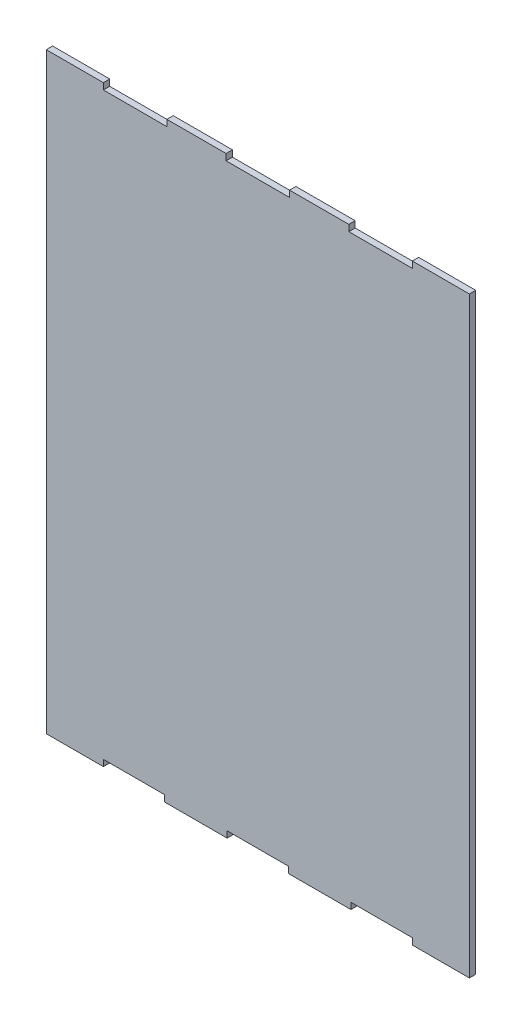
ISO-10303-21;
HEADER;
FILE_DESCRIPTION(('STEP AP214'),'2;1');
FILE_NAME('part.step','',(''),(''),'','','');
FILE_SCHEMA(('AUTOMOTIVE_DESIGN { 1 0 10303 214 1 1 1 1 }'));
ENDSEC;
DATA;
#1=APPLICATION_CONTEXT('core data for automotive mechanical design processes');
#2=APPLICATION_PROTOCOL_DEFINITION('international standard','automotive_design',2000,#1);
#3=PRODUCT_CONTEXT('',#1,'mechanical');
#4=PRODUCT('Part','Part','',(#3));
#5=PRODUCT_RELATED_PRODUCT_CATEGORY('part','',(#4));
#6=PRODUCT_DEFINITION_FORMATION('','',#4);
#7=PRODUCT_DEFINITION_CONTEXT('part definition',#1,'design');
#8=PRODUCT_DEFINITION('design','',#6,#7);
#9=PRODUCT_DEFINITION_SHAPE('','',#8);
#10=(LENGTH_UNIT() NAMED_UNIT(*) SI_UNIT(.MILLI.,.METRE.));
#11=(NAMED_UNIT(*) PLANE_ANGLE_UNIT() SI_UNIT($,.RADIAN.));
#12=(NAMED_UNIT(*) SI_UNIT($,.STERADIAN.) SOLID_ANGLE_UNIT());
#13=UNCERTAINTY_MEASURE_WITH_UNIT(LENGTH_MEASURE(1.E-05),#10,'distance_accuracy_value','');
#14=(GEOMETRIC_REPRESENTATION_CONTEXT(3) GLOBAL_UNCERTAINTY_ASSIGNED_CONTEXT((#13)) GLOBAL_UNIT_ASSIGNED_CONTEXT((#10,
#11,#12)) REPRESENTATION_CONTEXT('',''));
#15=CARTESIAN_POINT('',(0.,0.,0.));
#16=DIRECTION('',(0.,0.,1.));
#17=DIRECTION('',(1.,0.,0.));
#18=AXIS2_PLACEMENT_3D('',#15,#16,#17);
#19=CARTESIAN_POINT('',(0.,140.,3.));
#20=DIRECTION('',(0.,1.,0.));
#21=DIRECTION('',(0.,0.,1.));
#22=AXIS2_PLACEMENT_3D('',#19,#20,#21);
#23=PLANE('',#22);
#24=DIRECTION('',(1.,0.,0.));
#25=VECTOR('',#24,1.);
#26=CARTESIAN_POINT('',(0.,140.,0.));
#27=LINE('',#26,#25);
#28=CARTESIAN_POINT('',(76.,140.,0.));
#29=VERTEX_POINT('',#28);
#30=CARTESIAN_POINT('',(103.,140.,0.));
#31=VERTEX_POINT('',#30);
#32=EDGE_CURVE('E262',#29,#31,#27,.T.);
#33=ORIENTED_EDGE('',*,*,#32,.F.);
#34=DIRECTION('',(0.,0.,-1.));
#35=VECTOR('',#34,1.);
#36=CARTESIAN_POINT('',(76.,140.,3.));
#37=LINE('',#36,#35);
#38=CARTESIAN_POINT('',(76.,140.,3.));
#39=VERTEX_POINT('',#38);
#40=EDGE_CURVE('E11',#39,#29,#37,.T.);
#41=ORIENTED_EDGE('',*,*,#40,.F.);
#42=DIRECTION('',(1.,0.,0.));
#43=VECTOR('',#42,1.);
#44=CARTESIAN_POINT('',(0.,140.,3.));
#45=LINE('',#44,#43);
#46=CARTESIAN_POINT('',(103.,140.,3.));
#47=VERTEX_POINT('',#46);
#48=EDGE_CURVE('E363',#39,#47,#45,.T.);
#49=ORIENTED_EDGE('',*,*,#48,.T.);
#50=DIRECTION('',(0.,0.,-1.));
#51=VECTOR('',#50,1.);
#52=CARTESIAN_POINT('',(103.,140.,3.));
#53=LINE('',#52,#51);
#54=EDGE_CURVE('E58',#47,#31,#53,.T.);
#55=ORIENTED_EDGE('',*,*,#54,.T.);
#56=EDGE_LOOP('',(#33,#41,#49,#55));
#57=FACE_BOUND('',#56,.T.);
#58=ADVANCED_FACE('F41',(#57),#23,.T.);
#59=CARTESIAN_POINT('',(76.,0.,3.));
#60=DIRECTION('',(1.,0.,0.));
#61=DIRECTION('',(0.,0.,-1.));
#62=AXIS2_PLACEMENT_3D('',#59,#60,#61);
#63=PLANE('',#62);
#64=DIRECTION('',(0.,-1.,0.));
#65=VECTOR('',#64,1.);
#66=CARTESIAN_POINT('',(76.,0.,0.));
#67=LINE('',#66,#65);
#68=CARTESIAN_POINT('',(76.,137.,0.));
#69=VERTEX_POINT('',#68);
#70=EDGE_CURVE('E265',#29,#69,#67,.T.);
#71=ORIENTED_EDGE('',*,*,#70,.T.);
#72=DIRECTION('',(0.,0.,-1.));
#73=VECTOR('',#72,1.);
#74=CARTESIAN_POINT('',(76.,137.,3.));
#75=LINE('',#74,#73);
#76=CARTESIAN_POINT('',(76.,137.,3.));
#77=VERTEX_POINT('',#76);
#78=EDGE_CURVE('E50',#77,#69,#75,.T.);
#79=ORIENTED_EDGE('',*,*,#78,.F.);
#80=DIRECTION('',(0.,-1.,0.));
#81=VECTOR('',#80,1.);
#82=CARTESIAN_POINT('',(76.,0.,3.));
#83=LINE('',#82,#81);
#84=EDGE_CURVE('E465',#39,#77,#83,.T.);
#85=ORIENTED_EDGE('',*,*,#84,.F.);
#86=ORIENTED_EDGE('',*,*,#40,.T.);
#87=EDGE_LOOP('',(#71,#79,#85,#86));
#88=FACE_BOUND('',#87,.T.);
#89=ADVANCED_FACE('F452',(#88),#63,.F.);
#90=CARTESIAN_POINT('',(0.,137.,3.));
#91=DIRECTION('',(0.,1.,0.));
#92=DIRECTION('',(0.,0.,1.));
#93=AXIS2_PLACEMENT_3D('',#90,#91,#92);
#94=PLANE('',#93);
#95=DIRECTION('',(1.,0.,0.));
#96=VECTOR('',#95,1.);
#97=CARTESIAN_POINT('',(0.,137.,0.));
#98=LINE('',#97,#96);
#99=CARTESIAN_POINT('',(46.,137.,0.));
#100=VERTEX_POINT('',#99);
#101=EDGE_CURVE('E269',#100,#69,#98,.T.);
#102=ORIENTED_EDGE('',*,*,#101,.F.);
#103=DIRECTION('',(0.,0.,-1.));
#104=VECTOR('',#103,1.);
#105=CARTESIAN_POINT('',(46.,137.,3.));
#106=LINE('',#105,#104);
#107=CARTESIAN_POINT('',(46.,137.,3.));
#108=VERTEX_POINT('',#107);
#109=EDGE_CURVE('E440',#108,#100,#106,.T.);
#110=ORIENTED_EDGE('',*,*,#109,.F.);
#111=DIRECTION('',(1.,0.,0.));
#112=VECTOR('',#111,1.);
#113=CARTESIAN_POINT('',(0.,137.,3.));
#114=LINE('',#113,#112);
#115=EDGE_CURVE('E449',#108,#77,#114,.T.);
#116=ORIENTED_EDGE('',*,*,#115,.T.);
#117=ORIENTED_EDGE('',*,*,#78,.T.);
#118=EDGE_LOOP('',(#102,#110,#116,#117));
#119=FACE_BOUND('',#118,.T.);
#120=ADVANCED_FACE('F447',(#119),#94,.T.);
#121=CARTESIAN_POINT('',(46.,0.,3.));
#122=DIRECTION('',(1.,0.,0.));
#123=DIRECTION('',(0.,0.,-1.));
#124=AXIS2_PLACEMENT_3D('',#121,#122,#123);
#125=PLANE('',#124);
#126=DIRECTION('',(0.,-1.,0.));
#127=VECTOR('',#126,1.);
#128=CARTESIAN_POINT('',(46.,0.,0.));
#129=LINE('',#128,#127);
#130=CARTESIAN_POINT('',(46.,140.,0.));
#131=VERTEX_POINT('',#130);
#132=EDGE_CURVE('E273',#131,#100,#129,.T.);
#133=ORIENTED_EDGE('',*,*,#132,.F.);
#134=DIRECTION('',(0.,0.,-1.));
#135=VECTOR('',#134,1.);
#136=CARTESIAN_POINT('',(46.,140.,3.));
#137=LINE('',#136,#135);
#138=CARTESIAN_POINT('',(46.,140.,3.));
#139=VERTEX_POINT('',#138);
#140=EDGE_CURVE('E437',#139,#131,#137,.T.);
#141=ORIENTED_EDGE('',*,*,#140,.F.);
#142=DIRECTION('',(0.,-1.,0.));
#143=VECTOR('',#142,1.);
#144=CARTESIAN_POINT('',(46.,0.,3.));
#145=LINE('',#144,#143);
#146=EDGE_CURVE('E462',#139,#108,#145,.T.);
#147=ORIENTED_EDGE('',*,*,#146,.T.);
#148=ORIENTED_EDGE('',*,*,#109,.T.);
#149=EDGE_LOOP('',(#133,#141,#147,#148));
#150=FACE_BOUND('',#149,.T.);
#151=ADVANCED_FACE('F459',(#150),#125,.T.);
#152=CARTESIAN_POINT('',(0.,140.,3.));
#153=DIRECTION('',(0.,1.,0.));
#154=DIRECTION('',(0.,0.,1.));
#155=AXIS2_PLACEMENT_3D('',#152,#153,#154);
#156=PLANE('',#155);
#157=DIRECTION('',(1.,0.,0.));
#158=VECTOR('',#157,1.);
#159=CARTESIAN_POINT('',(0.,140.,0.));
#160=LINE('',#159,#158);
#161=CARTESIAN_POINT('',(18.,140.,0.));
#162=VERTEX_POINT('',#161);
#163=EDGE_CURVE('E277',#162,#131,#160,.T.);
#164=ORIENTED_EDGE('',*,*,#163,.F.);
#165=DIRECTION('',(0.,0.,-1.));
#166=VECTOR('',#165,1.);
#167=CARTESIAN_POINT('',(18.,140.,3.));
#168=LINE('',#167,#166);
#169=CARTESIAN_POINT('',(18.,140.,3.));
#170=VERTEX_POINT('',#169);
#171=EDGE_CURVE('E434',#170,#162,#168,.T.);
#172=ORIENTED_EDGE('',*,*,#171,.F.);
#173=DIRECTION('',(1.,0.,0.));
#174=VECTOR('',#173,1.);
#175=CARTESIAN_POINT('',(0.,140.,3.));
#176=LINE('',#175,#174);
#177=EDGE_CURVE('E470',#170,#139,#176,.T.);
#178=ORIENTED_EDGE('',*,*,#177,.T.);
#179=ORIENTED_EDGE('',*,*,#140,.T.);
#180=EDGE_LOOP('',(#164,#172,#178,#179));
#181=FACE_BOUND('',#180,.T.);
#182=ADVANCED_FACE('F571',(#181),#156,.T.);
#183=CARTESIAN_POINT('',(18.,0.,3.));
#184=DIRECTION('',(1.,0.,0.));
#185=DIRECTION('',(0.,0.,-1.));
#186=AXIS2_PLACEMENT_3D('',#183,#184,#185);
#187=PLANE('',#186);
#188=DIRECTION('',(0.,-1.,0.));
#189=VECTOR('',#188,1.);
#190=CARTESIAN_POINT('',(18.,0.,0.));
#191=LINE('',#190,#189);
#192=CARTESIAN_POINT('',(18.,137.,0.));
#193=VERTEX_POINT('',#192);
#194=EDGE_CURVE('E281',#162,#193,#191,.T.);
#195=ORIENTED_EDGE('',*,*,#194,.T.);
#196=DIRECTION('',(0.,0.,-1.));
#197=VECTOR('',#196,1.);
#198=CARTESIAN_POINT('',(18.,137.,3.));
#199=LINE('',#198,#197);
#200=CARTESIAN_POINT('',(18.,137.,3.));
#201=VERTEX_POINT('',#200);
#202=EDGE_CURVE('E431',#201,#193,#199,.T.);
#203=ORIENTED_EDGE('',*,*,#202,.F.);
#204=DIRECTION('',(0.,-1.,0.));
#205=VECTOR('',#204,1.);
#206=CARTESIAN_POINT('',(18.,0.,3.));
#207=LINE('',#206,#205);
#208=EDGE_CURVE('E477',#170,#201,#207,.T.);
#209=ORIENTED_EDGE('',*,*,#208,.F.);
#210=ORIENTED_EDGE('',*,*,#171,.T.);
#211=EDGE_LOOP('',(#195,#203,#209,#210));
#212=FACE_BOUND('',#211,.T.);
#213=ADVANCED_FACE('F574',(#212),#187,.F.);
#214=CARTESIAN_POINT('',(0.,137.,3.));
#215=DIRECTION('',(0.,1.,0.));
#216=DIRECTION('',(0.,0.,1.));
#217=AXIS2_PLACEMENT_3D('',#214,#215,#216);
#218=PLANE('',#217);
#219=DIRECTION('',(1.,0.,0.));
#220=VECTOR('',#219,1.);
#221=CARTESIAN_POINT('',(0.,137.,0.));
#222=LINE('',#221,#220);
#223=CARTESIAN_POINT('',(-12.,137.,0.));
#224=VERTEX_POINT('',#223);
#225=EDGE_CURVE('E285',#224,#193,#222,.T.);
#226=ORIENTED_EDGE('',*,*,#225,.F.);
#227=DIRECTION('',(0.,0.,-1.));
#228=VECTOR('',#227,1.);
#229=CARTESIAN_POINT('',(-12.,137.,3.));
#230=LINE('',#229,#228);
#231=CARTESIAN_POINT('',(-12.,137.,3.));
#232=VERTEX_POINT('',#231);
#233=EDGE_CURVE('E428',#232,#224,#230,.T.);
#234=ORIENTED_EDGE('',*,*,#233,.F.);
#235=DIRECTION('',(1.,0.,0.));
#236=VECTOR('',#235,1.);
#237=CARTESIAN_POINT('',(0.,137.,3.));
#238=LINE('',#237,#236);
#239=EDGE_CURVE('E480',#232,#201,#238,.T.);
#240=ORIENTED_EDGE('',*,*,#239,.T.);
#241=ORIENTED_EDGE('',*,*,#202,.T.);
#242=EDGE_LOOP('',(#226,#234,#240,#241));
#243=FACE_BOUND('',#242,.T.);
#244=ADVANCED_FACE('F578',(#243),#218,.T.);
#245=CARTESIAN_POINT('',(-12.,0.,3.));
#246=DIRECTION('',(1.,0.,0.));
#247=DIRECTION('',(0.,0.,-1.));
#248=AXIS2_PLACEMENT_3D('',#245,#246,#247);
#249=PLANE('',#248);
#250=DIRECTION('',(0.,-1.,0.));
#251=VECTOR('',#250,1.);
#252=CARTESIAN_POINT('',(-12.,0.,0.));
#253=LINE('',#252,#251);
#254=CARTESIAN_POINT('',(-12.,140.,0.));
#255=VERTEX_POINT('',#254);
#256=EDGE_CURVE('E289',#255,#224,#253,.T.);
#257=ORIENTED_EDGE('',*,*,#256,.F.);
#258=DIRECTION('',(0.,0.,-1.));
#259=VECTOR('',#258,1.);
#260=CARTESIAN_POINT('',(-12.,140.,3.));
#261=LINE('',#260,#259);
#262=CARTESIAN_POINT('',(-12.,140.,3.));
#263=VERTEX_POINT('',#262);
#264=EDGE_CURVE('E425',#263,#255,#261,.T.);
#265=ORIENTED_EDGE('',*,*,#264,.F.);
#266=DIRECTION('',(0.,-1.,0.));
#267=VECTOR('',#266,1.);
#268=CARTESIAN_POINT('',(-12.,0.,3.));
#269=LINE('',#268,#267);
#270=EDGE_CURVE('E484',#263,#232,#269,.T.);
#271=ORIENTED_EDGE('',*,*,#270,.T.);
#272=ORIENTED_EDGE('',*,*,#233,.T.);
#273=EDGE_LOOP('',(#257,#265,#271,#272));
#274=FACE_BOUND('',#273,.T.);
#275=ADVANCED_FACE('F582',(#274),#249,.T.);
#276=CARTESIAN_POINT('',(0.,140.,3.));
#277=DIRECTION('',(0.,1.,0.));
#278=DIRECTION('',(0.,0.,1.));
#279=AXIS2_PLACEMENT_3D('',#276,#277,#278);
#280=PLANE('',#279);
#281=DIRECTION('',(1.,0.,0.));
#282=VECTOR('',#281,1.);
#283=CARTESIAN_POINT('',(0.,140.,0.));
#284=LINE('',#283,#282);
#285=CARTESIAN_POINT('',(-40.,140.,0.));
#286=VERTEX_POINT('',#285);
#287=EDGE_CURVE('E293',#286,#255,#284,.T.);
#288=ORIENTED_EDGE('',*,*,#287,.F.);
#289=DIRECTION('',(0.,0.,-1.));
#290=VECTOR('',#289,1.);
#291=CARTESIAN_POINT('',(-40.,140.,3.));
#292=LINE('',#291,#290);
#293=CARTESIAN_POINT('',(-40.,140.,3.));
#294=VERTEX_POINT('',#293);
#295=EDGE_CURVE('E422',#294,#286,#292,.T.);
#296=ORIENTED_EDGE('',*,*,#295,.F.);
#297=DIRECTION('',(1.,0.,0.));
#298=VECTOR('',#297,1.);
#299=CARTESIAN_POINT('',(0.,140.,3.));
#300=LINE('',#299,#298);
#301=EDGE_CURVE('E488',#294,#263,#300,.T.);
#302=ORIENTED_EDGE('',*,*,#301,.T.);
#303=ORIENTED_EDGE('',*,*,#264,.T.);
#304=EDGE_LOOP('',(#288,#296,#302,#303));
#305=FACE_BOUND('',#304,.T.);
#306=ADVANCED_FACE('F586',(#305),#280,.T.);
#307=CARTESIAN_POINT('',(-39.9999999999997,0.,3.));
#308=DIRECTION('',(1.,0.,0.));
#309=DIRECTION('',(0.,1.,0.));
#310=AXIS2_PLACEMENT_3D('',#307,#308,#309);
#311=PLANE('',#310);
#312=DIRECTION('',(0.,-1.,0.));
#313=VECTOR('',#312,1.);
#314=CARTESIAN_POINT('',(-39.9999999999997,0.,0.));
#315=LINE('',#314,#313);
#316=CARTESIAN_POINT('',(-40.,137.,0.));
#317=VERTEX_POINT('',#316);
#318=EDGE_CURVE('E297',#286,#317,#315,.T.);
#319=ORIENTED_EDGE('',*,*,#318,.T.);
#320=DIRECTION('',(0.,0.,-1.));
#321=VECTOR('',#320,1.);
#322=CARTESIAN_POINT('',(-40.,137.,3.));
#323=LINE('',#322,#321);
#324=CARTESIAN_POINT('',(-40.,137.,3.));
#325=VERTEX_POINT('',#324);
#326=EDGE_CURVE('E419',#325,#317,#323,.T.);
#327=ORIENTED_EDGE('',*,*,#326,.F.);
#328=DIRECTION('',(0.,-1.,0.));
#329=VECTOR('',#328,1.);
#330=CARTESIAN_POINT('',(-39.9999999999997,0.,3.));
#331=LINE('',#330,#329);
#332=EDGE_CURVE('E492',#294,#325,#331,.T.);
#333=ORIENTED_EDGE('',*,*,#332,.F.);
#334=ORIENTED_EDGE('',*,*,#295,.T.);
#335=EDGE_LOOP('',(#319,#327,#333,#334));
#336=FACE_BOUND('',#335,.T.);
#337=ADVANCED_FACE('F590',(#336),#311,.F.);
#338=CARTESIAN_POINT('',(0.,137.,3.));
#339=DIRECTION('',(0.,1.,0.));
#340=DIRECTION('',(0.,0.,1.));
#341=AXIS2_PLACEMENT_3D('',#338,#339,#340);
#342=PLANE('',#341);
#343=DIRECTION('',(1.,0.,0.));
#344=VECTOR('',#343,1.);
#345=CARTESIAN_POINT('',(0.,137.,0.));
#346=LINE('',#345,#344);
#347=CARTESIAN_POINT('',(-70.,137.,0.));
#348=VERTEX_POINT('',#347);
#349=EDGE_CURVE('E301',#348,#317,#346,.T.);
#350=ORIENTED_EDGE('',*,*,#349,.F.);
#351=DIRECTION('',(0.,0.,-1.));
#352=VECTOR('',#351,1.);
#353=CARTESIAN_POINT('',(-70.,137.,3.));
#354=LINE('',#353,#352);
#355=CARTESIAN_POINT('',(-70.,137.,3.));
#356=VERTEX_POINT('',#355);
#357=EDGE_CURVE('E416',#356,#348,#354,.T.);
#358=ORIENTED_EDGE('',*,*,#357,.F.);
#359=DIRECTION('',(1.,0.,0.));
#360=VECTOR('',#359,1.);
#361=CARTESIAN_POINT('',(0.,137.,3.));
#362=LINE('',#361,#360);
#363=EDGE_CURVE('E495',#356,#325,#362,.T.);
#364=ORIENTED_EDGE('',*,*,#363,.T.);
#365=ORIENTED_EDGE('',*,*,#326,.T.);
#366=EDGE_LOOP('',(#350,#358,#364,#365));
#367=FACE_BOUND('',#366,.T.);
#368=ADVANCED_FACE('F594',(#367),#342,.T.);
#369=CARTESIAN_POINT('',(-70.,0.,3.));
#370=DIRECTION('',(1.,0.,0.));
#371=DIRECTION('',(0.,0.,-1.));
#372=AXIS2_PLACEMENT_3D('',#369,#370,#371);
#373=PLANE('',#372);
#374=DIRECTION('',(0.,-1.,0.));
#375=VECTOR('',#374,1.);
#376=CARTESIAN_POINT('',(-70.,0.,0.));
#377=LINE('',#376,#375);
#378=CARTESIAN_POINT('',(-70.,140.,0.));
#379=VERTEX_POINT('',#378);
#380=EDGE_CURVE('E305',#379,#348,#377,.T.);
#381=ORIENTED_EDGE('',*,*,#380,.F.);
#382=DIRECTION('',(0.,0.,-1.));
#383=VECTOR('',#382,1.);
#384=CARTESIAN_POINT('',(-70.,140.,3.));
#385=LINE('',#384,#383);
#386=CARTESIAN_POINT('',(-70.,140.,3.));
#387=VERTEX_POINT('',#386);
#388=EDGE_CURVE('E413',#387,#379,#385,.T.);
#389=ORIENTED_EDGE('',*,*,#388,.F.);
#390=DIRECTION('',(0.,-1.,0.));
#391=VECTOR('',#390,1.);
#392=CARTESIAN_POINT('',(-70.,0.,3.));
#393=LINE('',#392,#391);
#394=EDGE_CURVE('E499',#387,#356,#393,.T.);
#395=ORIENTED_EDGE('',*,*,#394,.T.);
#396=ORIENTED_EDGE('',*,*,#357,.T.);
#397=EDGE_LOOP('',(#381,#389,#395,#396));
#398=FACE_BOUND('',#397,.T.);
#399=ADVANCED_FACE('F598',(#398),#373,.T.);
#400=CARTESIAN_POINT('',(0.,140.,3.));
#401=DIRECTION('',(0.,1.,0.));
#402=DIRECTION('',(0.,0.,1.));
#403=AXIS2_PLACEMENT_3D('',#400,#401,#402);
#404=PLANE('',#403);
#405=DIRECTION('',(1.,0.,0.));
#406=VECTOR('',#405,1.);
#407=CARTESIAN_POINT('',(0.,140.,0.));
#408=LINE('',#407,#406);
#409=CARTESIAN_POINT('',(-97.,140.,0.));
#410=VERTEX_POINT('',#409);
#411=EDGE_CURVE('E309',#410,#379,#408,.T.);
#412=ORIENTED_EDGE('',*,*,#411,.F.);
#413=DIRECTION('',(0.,0.,-1.));
#414=VECTOR('',#413,1.);
#415=CARTESIAN_POINT('',(-97.,140.,3.));
#416=LINE('',#415,#414);
#417=CARTESIAN_POINT('',(-97.,140.,3.));
#418=VERTEX_POINT('',#417);
#419=EDGE_CURVE('E410',#418,#410,#416,.T.);
#420=ORIENTED_EDGE('',*,*,#419,.F.);
#421=DIRECTION('',(1.,0.,0.));
#422=VECTOR('',#421,1.);
#423=CARTESIAN_POINT('',(0.,140.,3.));
#424=LINE('',#423,#422);
#425=EDGE_CURVE('E503',#418,#387,#424,.T.);
#426=ORIENTED_EDGE('',*,*,#425,.T.);
#427=ORIENTED_EDGE('',*,*,#388,.T.);
#428=EDGE_LOOP('',(#412,#420,#426,#427));
#429=FACE_BOUND('',#428,.T.);
#430=ADVANCED_FACE('F602',(#429),#404,.T.);
#431=CARTESIAN_POINT('',(-97.,0.,3.));
#432=DIRECTION('',(1.,0.,0.));
#433=DIRECTION('',(0.,0.,-1.));
#434=AXIS2_PLACEMENT_3D('',#431,#432,#433);
#435=PLANE('',#434);
#436=DIRECTION('',(0.,-1.,0.));
#437=VECTOR('',#436,1.);
#438=CARTESIAN_POINT('',(-97.,0.,0.));
#439=LINE('',#438,#437);
#440=CARTESIAN_POINT('',(-97.,-140.,0.));
#441=VERTEX_POINT('',#440);
#442=EDGE_CURVE('E313',#410,#441,#439,.T.);
#443=ORIENTED_EDGE('',*,*,#442,.T.);
#444=DIRECTION('',(0.,0.,-1.));
#445=VECTOR('',#444,1.);
#446=CARTESIAN_POINT('',(-97.,-140.,3.));
#447=LINE('',#446,#445);
#448=CARTESIAN_POINT('',(-97.,-140.,3.));
#449=VERTEX_POINT('',#448);
#450=EDGE_CURVE('E406',#449,#441,#447,.T.);
#451=ORIENTED_EDGE('',*,*,#450,.F.);
#452=DIRECTION('',(0.,-1.,0.));
#453=VECTOR('',#452,1.);
#454=CARTESIAN_POINT('',(-97.,0.,3.));
#455=LINE('',#454,#453);
#456=EDGE_CURVE('E507',#418,#449,#455,.T.);
#457=ORIENTED_EDGE('',*,*,#456,.F.);
#458=ORIENTED_EDGE('',*,*,#419,.T.);
#459=EDGE_LOOP('',(#443,#451,#457,#458));
#460=FACE_BOUND('',#459,.T.);
#461=ADVANCED_FACE('F606',(#460),#435,.F.);
#462=CARTESIAN_POINT('',(0.,-140.,3.));
#463=DIRECTION('',(0.,1.,0.));
#464=DIRECTION('',(0.,0.,1.));
#465=AXIS2_PLACEMENT_3D('',#462,#463,#464);
#466=PLANE('',#465);
#467=DIRECTION('',(1.,0.,0.));
#468=VECTOR('',#467,1.);
#469=CARTESIAN_POINT('',(0.,-140.,0.));
#470=LINE('',#469,#468);
#471=CARTESIAN_POINT('',(-70.,-140.,0.));
#472=VERTEX_POINT('',#471);
#473=EDGE_CURVE('E316',#441,#472,#470,.T.);
#474=ORIENTED_EDGE('',*,*,#473,.T.);
#475=DIRECTION('',(0.,0.,-1.));
#476=VECTOR('',#475,1.);
#477=CARTESIAN_POINT('',(-70.,-140.,3.));
#478=LINE('',#477,#476);
#479=CARTESIAN_POINT('',(-70.,-140.,3.));
#480=VERTEX_POINT('',#479);
#481=EDGE_CURVE('E402',#480,#472,#478,.T.);
#482=ORIENTED_EDGE('',*,*,#481,.F.);
#483=DIRECTION('',(1.,0.,0.));
#484=VECTOR('',#483,1.);
#485=CARTESIAN_POINT('',(0.,-140.,3.));
#486=LINE('',#485,#484);
#487=EDGE_CURVE('E510',#449,#480,#486,.T.);
#488=ORIENTED_EDGE('',*,*,#487,.F.);
#489=ORIENTED_EDGE('',*,*,#450,.T.);
#490=EDGE_LOOP('',(#474,#482,#488,#489));
#491=FACE_BOUND('',#490,.T.);
#492=ADVANCED_FACE('F610',(#491),#466,.F.);
#493=CARTESIAN_POINT('',(-70.,0.,3.));
#494=DIRECTION('',(-1.,0.,0.));
#495=DIRECTION('',(0.,0.,1.));
#496=AXIS2_PLACEMENT_3D('',#493,#494,#495);
#497=PLANE('',#496);
#498=DIRECTION('',(0.,1.,0.));
#499=VECTOR('',#498,1.);
#500=CARTESIAN_POINT('',(-70.,0.,0.));
#501=LINE('',#500,#499);
#502=CARTESIAN_POINT('',(-70.,-137.,0.));
#503=VERTEX_POINT('',#502);
#504=EDGE_CURVE('E319',#472,#503,#501,.T.);
#505=ORIENTED_EDGE('',*,*,#504,.T.);
#506=DIRECTION('',(0.,0.,-1.));
#507=VECTOR('',#506,1.);
#508=CARTESIAN_POINT('',(-70.,-137.,3.));
#509=LINE('',#508,#507);
#510=CARTESIAN_POINT('',(-70.,-137.,3.));
#511=VERTEX_POINT('',#510);
#512=EDGE_CURVE('E398',#511,#503,#509,.T.);
#513=ORIENTED_EDGE('',*,*,#512,.F.);
#514=DIRECTION('',(0.,1.,0.));
#515=VECTOR('',#514,1.);
#516=CARTESIAN_POINT('',(-70.,0.,3.));
#517=LINE('',#516,#515);
#518=EDGE_CURVE('E513',#480,#511,#517,.T.);
#519=ORIENTED_EDGE('',*,*,#518,.F.);
#520=ORIENTED_EDGE('',*,*,#481,.T.);
#521=EDGE_LOOP('',(#505,#513,#519,#520));
#522=FACE_BOUND('',#521,.T.);
#523=ADVANCED_FACE('F614',(#522),#497,.F.);
#524=CARTESIAN_POINT('',(0.,-137.,3.));
#525=DIRECTION('',(0.,1.,0.));
#526=DIRECTION('',(0.,0.,1.));
#527=AXIS2_PLACEMENT_3D('',#524,#525,#526);
#528=PLANE('',#527);
#529=DIRECTION('',(1.,0.,0.));
#530=VECTOR('',#529,1.);
#531=CARTESIAN_POINT('',(0.,-137.,0.));
#532=LINE('',#531,#530);
#533=CARTESIAN_POINT('',(-41.,-137.,0.));
#534=VERTEX_POINT('',#533);
#535=EDGE_CURVE('E322',#503,#534,#532,.T.);
#536=ORIENTED_EDGE('',*,*,#535,.T.);
#537=DIRECTION('',(0.,0.,-1.));
#538=VECTOR('',#537,1.);
#539=CARTESIAN_POINT('',(-41.,-137.,3.));
#540=LINE('',#539,#538);
#541=CARTESIAN_POINT('',(-41.,-137.,3.));
#542=VERTEX_POINT('',#541);
#543=EDGE_CURVE('E395',#542,#534,#540,.T.);
#544=ORIENTED_EDGE('',*,*,#543,.F.);
#545=DIRECTION('',(1.,0.,0.));
#546=VECTOR('',#545,1.);
#547=CARTESIAN_POINT('',(0.,-137.,3.));
#548=LINE('',#547,#546);
#549=EDGE_CURVE('E516',#511,#542,#548,.T.);
#550=ORIENTED_EDGE('',*,*,#549,.F.);
#551=ORIENTED_EDGE('',*,*,#512,.T.);
#552=EDGE_LOOP('',(#536,#544,#550,#551));
#553=FACE_BOUND('',#552,.T.);
#554=ADVANCED_FACE('F618',(#553),#528,.F.);
#555=CARTESIAN_POINT('',(-41.,0.,3.));
#556=DIRECTION('',(-1.,0.,0.));
#557=DIRECTION('',(0.,0.,1.));
#558=AXIS2_PLACEMENT_3D('',#555,#556,#557);
#559=PLANE('',#558);
#560=DIRECTION('',(0.,1.,0.));
#561=VECTOR('',#560,1.);
#562=CARTESIAN_POINT('',(-41.,0.,0.));
#563=LINE('',#562,#561);
#564=CARTESIAN_POINT('',(-41.,-140.,0.));
#565=VERTEX_POINT('',#564);
#566=EDGE_CURVE('E326',#565,#534,#563,.T.);
#567=ORIENTED_EDGE('',*,*,#566,.F.);
#568=DIRECTION('',(0.,0.,-1.));
#569=VECTOR('',#568,1.);
#570=CARTESIAN_POINT('',(-41.,-140.,3.));
#571=LINE('',#570,#569);
#572=CARTESIAN_POINT('',(-41.,-140.,3.));
#573=VERTEX_POINT('',#572);
#574=EDGE_CURVE('E392',#573,#565,#571,.T.);
#575=ORIENTED_EDGE('',*,*,#574,.F.);
#576=DIRECTION('',(0.,1.,0.));
#577=VECTOR('',#576,1.);
#578=CARTESIAN_POINT('',(-41.,0.,3.));
#579=LINE('',#578,#577);
#580=EDGE_CURVE('E519',#573,#542,#579,.T.);
#581=ORIENTED_EDGE('',*,*,#580,.T.);
#582=ORIENTED_EDGE('',*,*,#543,.T.);
#583=EDGE_LOOP('',(#567,#575,#581,#582));
#584=FACE_BOUND('',#583,.T.);
#585=ADVANCED_FACE('F622',(#584),#559,.T.);
#586=CARTESIAN_POINT('',(0.,-140.,3.));
#587=DIRECTION('',(0.,1.,0.));
#588=DIRECTION('',(0.,0.,1.));
#589=AXIS2_PLACEMENT_3D('',#586,#587,#588);
#590=PLANE('',#589);
#591=DIRECTION('',(1.,0.,0.));
#592=VECTOR('',#591,1.);
#593=CARTESIAN_POINT('',(0.,-140.,0.));
#594=LINE('',#593,#592);
#595=CARTESIAN_POINT('',(-11.5,-140.,0.));
#596=VERTEX_POINT('',#595);
#597=EDGE_CURVE('E330',#565,#596,#594,.T.);
#598=ORIENTED_EDGE('',*,*,#597,.T.);
#599=DIRECTION('',(0.,0.,-1.));
#600=VECTOR('',#599,1.);
#601=CARTESIAN_POINT('',(-11.5,-140.,3.));
#602=LINE('',#601,#600);
#603=CARTESIAN_POINT('',(-11.5,-140.,3.));
#604=VERTEX_POINT('',#603);
#605=EDGE_CURVE('E388',#604,#596,#602,.T.);
#606=ORIENTED_EDGE('',*,*,#605,.F.);
#607=DIRECTION('',(1.,0.,0.));
#608=VECTOR('',#607,1.);
#609=CARTESIAN_POINT('',(0.,-140.,3.));
#610=LINE('',#609,#608);
#611=EDGE_CURVE('E523',#573,#604,#610,.T.);
#612=ORIENTED_EDGE('',*,*,#611,.F.);
#613=ORIENTED_EDGE('',*,*,#574,.T.);
#614=EDGE_LOOP('',(#598,#606,#612,#613));
#615=FACE_BOUND('',#614,.T.);
#616=ADVANCED_FACE('F626',(#615),#590,.F.);
#617=CARTESIAN_POINT('',(-11.5,0.,3.));
#618=DIRECTION('',(-1.,0.,0.));
#619=DIRECTION('',(0.,0.,1.));
#620=AXIS2_PLACEMENT_3D('',#617,#618,#619);
#621=PLANE('',#620);
#622=DIRECTION('',(0.,1.,0.));
#623=VECTOR('',#622,1.);
#624=CARTESIAN_POINT('',(-11.5,0.,0.));
#625=LINE('',#624,#623);
#626=CARTESIAN_POINT('',(-11.5,-137.,0.));
#627=VERTEX_POINT('',#626);
#628=EDGE_CURVE('E333',#596,#627,#625,.T.);
#629=ORIENTED_EDGE('',*,*,#628,.T.);
#630=DIRECTION('',(0.,0.,-1.));
#631=VECTOR('',#630,1.);
#632=CARTESIAN_POINT('',(-11.5,-137.,3.));
#633=LINE('',#632,#631);
#634=CARTESIAN_POINT('',(-11.5,-137.,3.));
#635=VERTEX_POINT('',#634);
#636=EDGE_CURVE('E384',#635,#627,#633,.T.);
#637=ORIENTED_EDGE('',*,*,#636,.F.);
#638=DIRECTION('',(0.,1.,0.));
#639=VECTOR('',#638,1.);
#640=CARTESIAN_POINT('',(-11.5,0.,3.));
#641=LINE('',#640,#639);
#642=EDGE_CURVE('E526',#604,#635,#641,.T.);
#643=ORIENTED_EDGE('',*,*,#642,.F.);
#644=ORIENTED_EDGE('',*,*,#605,.T.);
#645=EDGE_LOOP('',(#629,#637,#643,#644));
#646=FACE_BOUND('',#645,.T.);
#647=ADVANCED_FACE('F630',(#646),#621,.F.);
#648=CARTESIAN_POINT('',(0.,-137.,3.));
#649=DIRECTION('',(0.,1.,0.));
#650=DIRECTION('',(0.,0.,1.));
#651=AXIS2_PLACEMENT_3D('',#648,#649,#650);
#652=PLANE('',#651);
#653=DIRECTION('',(1.,0.,0.));
#654=VECTOR('',#653,1.);
#655=CARTESIAN_POINT('',(0.,-137.,0.));
#656=LINE('',#655,#654);
#657=CARTESIAN_POINT('',(17.5,-137.,0.));
#658=VERTEX_POINT('',#657);
#659=EDGE_CURVE('E336',#627,#658,#656,.T.);
#660=ORIENTED_EDGE('',*,*,#659,.T.);
#661=DIRECTION('',(0.,0.,-1.));
#662=VECTOR('',#661,1.);
#663=CARTESIAN_POINT('',(17.5,-137.,3.));
#664=LINE('',#663,#662);
#665=CARTESIAN_POINT('',(17.5,-137.,3.));
#666=VERTEX_POINT('',#665);
#667=EDGE_CURVE('E381',#666,#658,#664,.T.);
#668=ORIENTED_EDGE('',*,*,#667,.F.);
#669=DIRECTION('',(1.,0.,0.));
#670=VECTOR('',#669,1.);
#671=CARTESIAN_POINT('',(0.,-137.,3.));
#672=LINE('',#671,#670);
#673=EDGE_CURVE('E529',#635,#666,#672,.T.);
#674=ORIENTED_EDGE('',*,*,#673,.F.);
#675=ORIENTED_EDGE('',*,*,#636,.T.);
#676=EDGE_LOOP('',(#660,#668,#674,#675));
#677=FACE_BOUND('',#676,.T.);
#678=ADVANCED_FACE('F634',(#677),#652,.F.);
#679=CARTESIAN_POINT('',(17.5,0.,3.));
#680=DIRECTION('',(-1.,0.,0.));
#681=DIRECTION('',(0.,0.,1.));
#682=AXIS2_PLACEMENT_3D('',#679,#680,#681);
#683=PLANE('',#682);
#684=DIRECTION('',(0.,1.,0.));
#685=VECTOR('',#684,1.);
#686=CARTESIAN_POINT('',(17.5,0.,0.));
#687=LINE('',#686,#685);
#688=CARTESIAN_POINT('',(17.5,-140.,0.));
#689=VERTEX_POINT('',#688);
#690=EDGE_CURVE('E340',#689,#658,#687,.T.);
#691=ORIENTED_EDGE('',*,*,#690,.F.);
#692=DIRECTION('',(0.,0.,-1.));
#693=VECTOR('',#692,1.);
#694=CARTESIAN_POINT('',(17.5,-140.,3.));
#695=LINE('',#694,#693);
#696=CARTESIAN_POINT('',(17.5,-140.,3.));
#697=VERTEX_POINT('',#696);
#698=EDGE_CURVE('E378',#697,#689,#695,.T.);
#699=ORIENTED_EDGE('',*,*,#698,.F.);
#700=DIRECTION('',(0.,1.,0.));
#701=VECTOR('',#700,1.);
#702=CARTESIAN_POINT('',(17.5,0.,3.));
#703=LINE('',#702,#701);
#704=EDGE_CURVE('E532',#697,#666,#703,.T.);
#705=ORIENTED_EDGE('',*,*,#704,.T.);
#706=ORIENTED_EDGE('',*,*,#667,.T.);
#707=EDGE_LOOP('',(#691,#699,#705,#706));
#708=FACE_BOUND('',#707,.T.);
#709=ADVANCED_FACE('F638',(#708),#683,.T.);
#710=CARTESIAN_POINT('',(0.,-140.,3.));
#711=DIRECTION('',(0.,1.,0.));
#712=DIRECTION('',(0.,0.,1.));
#713=AXIS2_PLACEMENT_3D('',#710,#711,#712);
#714=PLANE('',#713);
#715=DIRECTION('',(1.,0.,0.));
#716=VECTOR('',#715,1.);
#717=CARTESIAN_POINT('',(0.,-140.,0.));
#718=LINE('',#717,#716);
#719=CARTESIAN_POINT('',(47.,-140.,0.));
#720=VERTEX_POINT('',#719);
#721=EDGE_CURVE('E344',#689,#720,#718,.T.);
#722=ORIENTED_EDGE('',*,*,#721,.T.);
#723=DIRECTION('',(0.,0.,-1.));
#724=VECTOR('',#723,1.);
#725=CARTESIAN_POINT('',(47.,-140.,3.));
#726=LINE('',#725,#724);
#727=CARTESIAN_POINT('',(47.,-140.,3.));
#728=VERTEX_POINT('',#727);
#729=EDGE_CURVE('E374',#728,#720,#726,.T.);
#730=ORIENTED_EDGE('',*,*,#729,.F.);
#731=DIRECTION('',(1.,0.,0.));
#732=VECTOR('',#731,1.);
#733=CARTESIAN_POINT('',(0.,-140.,3.));
#734=LINE('',#733,#732);
#735=EDGE_CURVE('E536',#697,#728,#734,.T.);
#736=ORIENTED_EDGE('',*,*,#735,.F.);
#737=ORIENTED_EDGE('',*,*,#698,.T.);
#738=EDGE_LOOP('',(#722,#730,#736,#737));
#739=FACE_BOUND('',#738,.T.);
#740=ADVANCED_FACE('F642',(#739),#714,.F.);
#741=CARTESIAN_POINT('',(47.,0.,3.));
#742=DIRECTION('',(-1.,0.,0.));
#743=DIRECTION('',(0.,0.,1.));
#744=AXIS2_PLACEMENT_3D('',#741,#742,#743);
#745=PLANE('',#744);
#746=DIRECTION('',(0.,1.,0.));
#747=VECTOR('',#746,1.);
#748=CARTESIAN_POINT('',(47.,0.,0.));
#749=LINE('',#748,#747);
#750=CARTESIAN_POINT('',(47.,-137.,0.));
#751=VERTEX_POINT('',#750);
#752=EDGE_CURVE('E347',#720,#751,#749,.T.);
#753=ORIENTED_EDGE('',*,*,#752,.T.);
#754=DIRECTION('',(0.,0.,-1.));
#755=VECTOR('',#754,1.);
#756=CARTESIAN_POINT('',(47.,-137.,3.));
#757=LINE('',#756,#755);
#758=CARTESIAN_POINT('',(47.,-137.,3.));
#759=VERTEX_POINT('',#758);
#760=EDGE_CURVE('E370',#759,#751,#757,.T.);
#761=ORIENTED_EDGE('',*,*,#760,.F.);
#762=DIRECTION('',(0.,1.,0.));
#763=VECTOR('',#762,1.);
#764=CARTESIAN_POINT('',(47.,0.,3.));
#765=LINE('',#764,#763);
#766=EDGE_CURVE('E256',#728,#759,#765,.T.);
#767=ORIENTED_EDGE('',*,*,#766,.F.);
#768=ORIENTED_EDGE('',*,*,#729,.T.);
#769=EDGE_LOOP('',(#753,#761,#767,#768));
#770=FACE_BOUND('',#769,.T.);
#771=ADVANCED_FACE('F545',(#770),#745,.F.);
#772=CARTESIAN_POINT('',(0.,-137.,3.));
#773=DIRECTION('',(0.,1.,0.));
#774=DIRECTION('',(0.,0.,1.));
#775=AXIS2_PLACEMENT_3D('',#772,#773,#774);
#776=PLANE('',#775);
#777=DIRECTION('',(1.,0.,0.));
#778=VECTOR('',#777,1.);
#779=CARTESIAN_POINT('',(0.,-137.,0.));
#780=LINE('',#779,#778);
#781=CARTESIAN_POINT('',(76.,-137.,0.));
#782=VERTEX_POINT('',#781);
#783=EDGE_CURVE('E350',#751,#782,#780,.T.);
#784=ORIENTED_EDGE('',*,*,#783,.T.);
#785=DIRECTION('',(0.,0.,-1.));
#786=VECTOR('',#785,1.);
#787=CARTESIAN_POINT('',(76.,-137.,3.));
#788=LINE('',#787,#786);
#789=CARTESIAN_POINT('',(76.,-137.,3.));
#790=VERTEX_POINT('',#789);
#791=EDGE_CURVE('E239',#790,#782,#788,.T.);
#792=ORIENTED_EDGE('',*,*,#791,.F.);
#793=DIRECTION('',(1.,0.,0.));
#794=VECTOR('',#793,1.);
#795=CARTESIAN_POINT('',(0.,-137.,3.));
#796=LINE('',#795,#794);
#797=EDGE_CURVE('E251',#759,#790,#796,.T.);
#798=ORIENTED_EDGE('',*,*,#797,.F.);
#799=ORIENTED_EDGE('',*,*,#760,.T.);
#800=EDGE_LOOP('',(#784,#792,#798,#799));
#801=FACE_BOUND('',#800,.T.);
#802=ADVANCED_FACE('F549',(#801),#776,.F.);
#803=CARTESIAN_POINT('',(76.0000000000006,-3.51570624464635E-13,3.));
#804=DIRECTION('',(-1.,0.,0.));
#805=DIRECTION('',(0.,-1.,0.));
#806=AXIS2_PLACEMENT_3D('',#803,#804,#805);
#807=PLANE('',#806);
#808=DIRECTION('',(0.,1.,0.));
#809=VECTOR('',#808,1.);
#810=CARTESIAN_POINT('',(76.0000000000006,-3.51570624464635E-13,0.));
#811=LINE('',#810,#809);
#812=CARTESIAN_POINT('',(76.,-140.,0.));
#813=VERTEX_POINT('',#812);
#814=EDGE_CURVE('E235',#813,#782,#811,.T.);
#815=ORIENTED_EDGE('',*,*,#814,.F.);
#816=DIRECTION('',(0.,0.,-1.));
#817=VECTOR('',#816,1.);
#818=CARTESIAN_POINT('',(76.,-140.,3.));
#819=LINE('',#818,#817);
#820=CARTESIAN_POINT('',(76.,-140.,3.));
#821=VERTEX_POINT('',#820);
#822=EDGE_CURVE('E229',#821,#813,#819,.T.);
#823=ORIENTED_EDGE('',*,*,#822,.F.);
#824=DIRECTION('',(0.,1.,0.));
#825=VECTOR('',#824,1.);
#826=CARTESIAN_POINT('',(76.0000000000006,-3.51570624464635E-13,3.));
#827=LINE('',#826,#825);
#828=EDGE_CURVE('E233',#821,#790,#827,.T.);
#829=ORIENTED_EDGE('',*,*,#828,.T.);
#830=ORIENTED_EDGE('',*,*,#791,.T.);
#831=EDGE_LOOP('',(#815,#823,#829,#830));
#832=FACE_BOUND('',#831,.T.);
#833=ADVANCED_FACE('F231',(#832),#807,.T.);
#834=CARTESIAN_POINT('',(0.,-140.,3.));
#835=DIRECTION('',(0.,1.,0.));
#836=DIRECTION('',(0.,0.,1.));
#837=AXIS2_PLACEMENT_3D('',#834,#835,#836);
#838=PLANE('',#837);
#839=DIRECTION('',(1.,0.,0.));
#840=VECTOR('',#839,1.);
#841=CARTESIAN_POINT('',(0.,-140.,0.));
#842=LINE('',#841,#840);
#843=CARTESIAN_POINT('',(103.,-140.,0.));
#844=VERTEX_POINT('',#843);
#845=EDGE_CURVE('E356',#813,#844,#842,.T.);
#846=ORIENTED_EDGE('',*,*,#845,.T.);
#847=DIRECTION('',(0.,0.,-1.));
#848=VECTOR('',#847,1.);
#849=CARTESIAN_POINT('',(103.,-140.,3.));
#850=LINE('',#849,#848);
#851=CARTESIAN_POINT('',(103.,-140.,3.));
#852=VERTEX_POINT('',#851);
#853=EDGE_CURVE('E144',#852,#844,#850,.T.);
#854=ORIENTED_EDGE('',*,*,#853,.F.);
#855=DIRECTION('',(1.,0.,0.));
#856=VECTOR('',#855,1.);
#857=CARTESIAN_POINT('',(0.,-140.,3.));
#858=LINE('',#857,#856);
#859=EDGE_CURVE('E241',#821,#852,#858,.T.);
#860=ORIENTED_EDGE('',*,*,#859,.F.);
#861=ORIENTED_EDGE('',*,*,#822,.T.);
#862=EDGE_LOOP('',(#846,#854,#860,#861));
#863=FACE_BOUND('',#862,.T.);
#864=ADVANCED_FACE('F242',(#863),#838,.F.);
#865=CARTESIAN_POINT('',(103.,0.,3.));
#866=DIRECTION('',(1.,0.,0.));
#867=DIRECTION('',(0.,0.,-1.));
#868=AXIS2_PLACEMENT_3D('',#865,#866,#867);
#869=PLANE('',#868);
#870=DIRECTION('',(0.,-1.,0.));
#871=VECTOR('',#870,1.);
#872=CARTESIAN_POINT('',(103.,0.,0.));
#873=LINE('',#872,#871);
#874=EDGE_CURVE('E359',#31,#844,#873,.T.);
#875=ORIENTED_EDGE('',*,*,#874,.F.);
#876=ORIENTED_EDGE('',*,*,#54,.F.);
#877=DIRECTION('',(0.,-1.,0.));
#878=VECTOR('',#877,1.);
#879=CARTESIAN_POINT('',(103.,0.,3.));
#880=LINE('',#879,#878);
#881=EDGE_CURVE('E246',#47,#852,#880,.T.);
#882=ORIENTED_EDGE('',*,*,#881,.T.);
#883=ORIENTED_EDGE('',*,*,#853,.T.);
#884=EDGE_LOOP('',(#875,#876,#882,#883));
#885=FACE_BOUND('',#884,.T.);
#886=ADVANCED_FACE('F550',(#885),#869,.T.);
#887=CARTESIAN_POINT('',(0.,0.,3.));
#888=DIRECTION('',(0.,0.,1.));
#889=DIRECTION('',(1.,0.,0.));
#890=AXIS2_PLACEMENT_3D('',#887,#888,#889);
#891=PLANE('',#890);
#892=ORIENTED_EDGE('',*,*,#48,.F.);
#893=ORIENTED_EDGE('',*,*,#84,.T.);
#894=ORIENTED_EDGE('',*,*,#115,.F.);
#895=ORIENTED_EDGE('',*,*,#146,.F.);
#896=ORIENTED_EDGE('',*,*,#177,.F.);
#897=ORIENTED_EDGE('',*,*,#208,.T.);
#898=ORIENTED_EDGE('',*,*,#239,.F.);
#899=ORIENTED_EDGE('',*,*,#270,.F.);
#900=ORIENTED_EDGE('',*,*,#301,.F.);
#901=ORIENTED_EDGE('',*,*,#332,.T.);
#902=ORIENTED_EDGE('',*,*,#363,.F.);
#903=ORIENTED_EDGE('',*,*,#394,.F.);
#904=ORIENTED_EDGE('',*,*,#425,.F.);
#905=ORIENTED_EDGE('',*,*,#456,.T.);
#906=ORIENTED_EDGE('',*,*,#487,.T.);
#907=ORIENTED_EDGE('',*,*,#518,.T.);
#908=ORIENTED_EDGE('',*,*,#549,.T.);
#909=ORIENTED_EDGE('',*,*,#580,.F.);
#910=ORIENTED_EDGE('',*,*,#611,.T.);
#911=ORIENTED_EDGE('',*,*,#642,.T.);
#912=ORIENTED_EDGE('',*,*,#673,.T.);
#913=ORIENTED_EDGE('',*,*,#704,.F.);
#914=ORIENTED_EDGE('',*,*,#735,.T.);
#915=ORIENTED_EDGE('',*,*,#766,.T.);
#916=ORIENTED_EDGE('',*,*,#797,.T.);
#917=ORIENTED_EDGE('',*,*,#828,.F.);
#918=ORIENTED_EDGE('',*,*,#859,.T.);
#919=ORIENTED_EDGE('',*,*,#881,.F.);
#920=EDGE_LOOP('',(#892,#893,#894,#895,#896,#897,#898,#899,#900,#901,#902,#903,#904,#905,#906,
#907,#908,#909,#910,#911,#912,#913,#914,#915,#916,#917,#918,#919));
#921=FACE_BOUND('',#920,.T.);
#922=ADVANCED_FACE('F249',(#921),#891,.T.);
#923=CARTESIAN_POINT('',(0.,0.,0.));
#924=DIRECTION('',(0.,0.,1.));
#925=DIRECTION('',(1.,0.,0.));
#926=AXIS2_PLACEMENT_3D('',#923,#924,#925);
#927=PLANE('',#926);
#928=ORIENTED_EDGE('',*,*,#32,.T.);
#929=ORIENTED_EDGE('',*,*,#874,.T.);
#930=ORIENTED_EDGE('',*,*,#845,.F.);
#931=ORIENTED_EDGE('',*,*,#814,.T.);
#932=ORIENTED_EDGE('',*,*,#783,.F.);
#933=ORIENTED_EDGE('',*,*,#752,.F.);
#934=ORIENTED_EDGE('',*,*,#721,.F.);
#935=ORIENTED_EDGE('',*,*,#690,.T.);
#936=ORIENTED_EDGE('',*,*,#659,.F.);
#937=ORIENTED_EDGE('',*,*,#628,.F.);
#938=ORIENTED_EDGE('',*,*,#597,.F.);
#939=ORIENTED_EDGE('',*,*,#566,.T.);
#940=ORIENTED_EDGE('',*,*,#535,.F.);
#941=ORIENTED_EDGE('',*,*,#504,.F.);
#942=ORIENTED_EDGE('',*,*,#473,.F.);
#943=ORIENTED_EDGE('',*,*,#442,.F.);
#944=ORIENTED_EDGE('',*,*,#411,.T.);
#945=ORIENTED_EDGE('',*,*,#380,.T.);
#946=ORIENTED_EDGE('',*,*,#349,.T.);
#947=ORIENTED_EDGE('',*,*,#318,.F.);
#948=ORIENTED_EDGE('',*,*,#287,.T.);
#949=ORIENTED_EDGE('',*,*,#256,.T.);
#950=ORIENTED_EDGE('',*,*,#225,.T.);
#951=ORIENTED_EDGE('',*,*,#194,.F.);
#952=ORIENTED_EDGE('',*,*,#163,.T.);
#953=ORIENTED_EDGE('',*,*,#132,.T.);
#954=ORIENTED_EDGE('',*,*,#101,.T.);
#955=ORIENTED_EDGE('',*,*,#70,.F.);
#956=EDGE_LOOP('',(#928,#929,#930,#931,#932,#933,#934,#935,#936,#937,#938,#939,#940,#941,#942,
#943,#944,#945,#946,#947,#948,#949,#950,#951,#952,#953,#954,#955));
#957=FACE_BOUND('',#956,.T.);
#958=ADVANCED_FACE('F454',(#957),#927,.F.);
#959=CLOSED_SHELL('',(#58,#89,#120,#151,#182,#213,#244,#275,#306,#337,#368,#399,#430,#461,#492,
#523,#554,#585,#616,#647,#678,#709,#740,#771,#802,#833,#864,#886,#922,#958));
#960=MANIFOLD_SOLID_BREP('B2',#959);
#961=ADVANCED_BREP_SHAPE_REPRESENTATION('',(#18,#960),#14);
#962=SHAPE_DEFINITION_REPRESENTATION(#9,#961);
ENDSEC;
END-ISO-10303-21;
